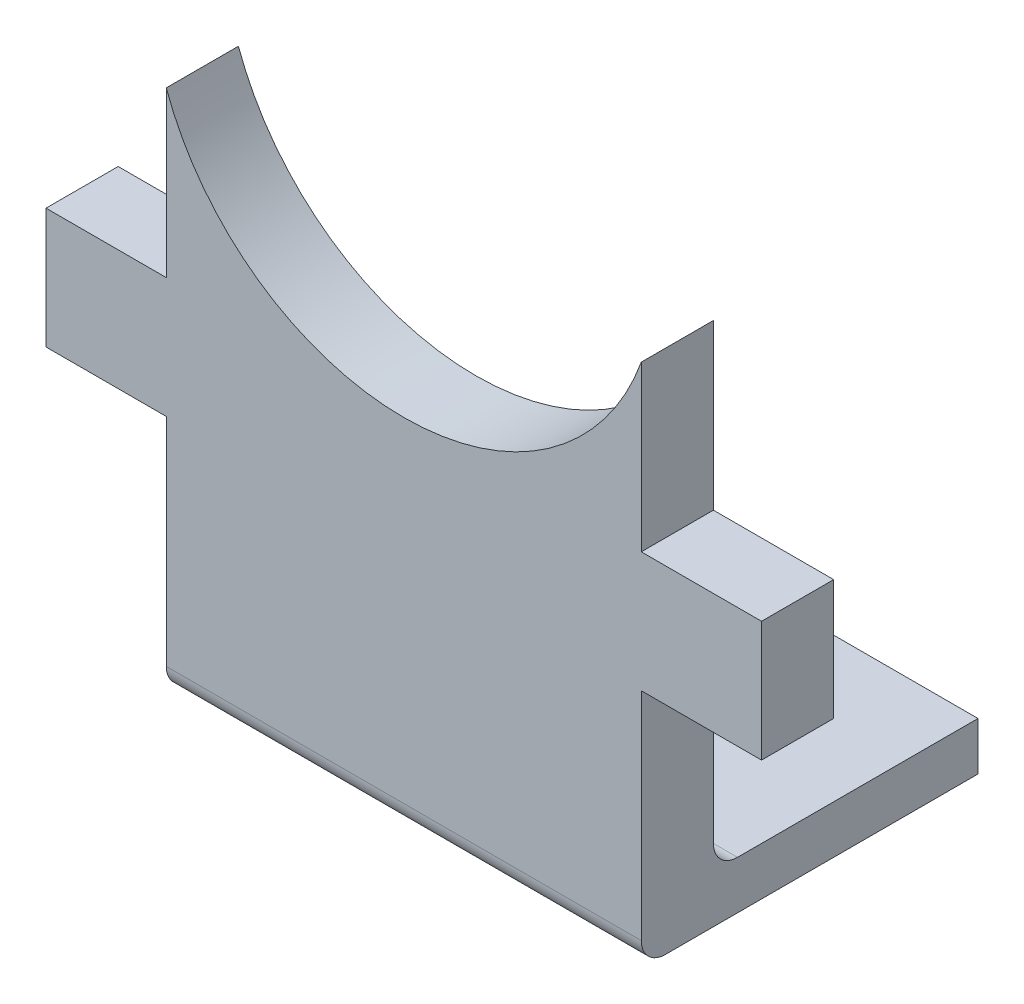
ISO-10303-21;
HEADER;
FILE_DESCRIPTION(('STEP AP214'),'2;1');
FILE_NAME('part.step','',(''),(''),'','','');
FILE_SCHEMA(('AUTOMOTIVE_DESIGN { 1 0 10303 214 1 1 1 1 }'));
ENDSEC;
DATA;
#1=APPLICATION_CONTEXT('core data for automotive mechanical design processes');
#2=APPLICATION_PROTOCOL_DEFINITION('international standard','automotive_design',2000,#1);
#3=PRODUCT_CONTEXT('',#1,'mechanical');
#4=PRODUCT('Part','Part','',(#3));
#5=PRODUCT_RELATED_PRODUCT_CATEGORY('part','',(#4));
#6=PRODUCT_DEFINITION_FORMATION('','',#4);
#7=PRODUCT_DEFINITION_CONTEXT('part definition',#1,'design');
#8=PRODUCT_DEFINITION('design','',#6,#7);
#9=PRODUCT_DEFINITION_SHAPE('','',#8);
#10=(LENGTH_UNIT() NAMED_UNIT(*) SI_UNIT(.MILLI.,.METRE.));
#11=(NAMED_UNIT(*) PLANE_ANGLE_UNIT() SI_UNIT($,.RADIAN.));
#12=(NAMED_UNIT(*) SI_UNIT($,.STERADIAN.) SOLID_ANGLE_UNIT());
#13=UNCERTAINTY_MEASURE_WITH_UNIT(LENGTH_MEASURE(1.E-05),#10,'distance_accuracy_value','');
#14=(GEOMETRIC_REPRESENTATION_CONTEXT(3) GLOBAL_UNCERTAINTY_ASSIGNED_CONTEXT((#13)) GLOBAL_UNIT_ASSIGNED_CONTEXT((#10,
#11,#12)) REPRESENTATION_CONTEXT('',''));
#15=CARTESIAN_POINT('',(0.,0.,0.));
#16=DIRECTION('',(0.,0.,1.));
#17=DIRECTION('',(1.,0.,0.));
#18=AXIS2_PLACEMENT_3D('',#15,#16,#17);
#19=CARTESIAN_POINT('',(0.,0.,0.));
#20=DIRECTION('',(0.,0.,1.));
#21=DIRECTION('',(1.,0.,0.));
#22=AXIS2_PLACEMENT_3D('',#19,#20,#21);
#23=PLANE('',#22);
#24=DIRECTION('',(0.,1.,0.));
#25=VECTOR('',#24,1.);
#26=CARTESIAN_POINT('',(9.875,0.,0.));
#27=LINE('',#26,#25);
#28=CARTESIAN_POINT('',(9.875,-22.4,0.));
#29=VERTEX_POINT('',#28);
#30=CARTESIAN_POINT('',(9.875,-15.4,0.));
#31=VERTEX_POINT('',#30);
#32=EDGE_CURVE('E254',#29,#31,#27,.T.);
#33=ORIENTED_EDGE('',*,*,#32,.F.);
#34=DIRECTION('',(1.,0.,0.));
#35=VECTOR('',#34,1.);
#36=CARTESIAN_POINT('',(-9.875,-22.4,0.));
#37=LINE('',#36,#35);
#38=CARTESIAN_POINT('',(-9.875,-22.4,0.));
#39=VERTEX_POINT('',#38);
#40=EDGE_CURVE('E68',#29,#39,#37,.F.);
#41=ORIENTED_EDGE('',*,*,#40,.T.);
#42=DIRECTION('',(0.,-1.,0.));
#43=VECTOR('',#42,1.);
#44=CARTESIAN_POINT('',(-9.875,0.,0.));
#45=LINE('',#44,#43);
#46=CARTESIAN_POINT('',(-9.875,-15.4,0.));
#47=VERTEX_POINT('',#46);
#48=EDGE_CURVE('E243',#47,#39,#45,.T.);
#49=ORIENTED_EDGE('',*,*,#48,.F.);
#50=DIRECTION('',(-1.,0.,0.));
#51=VECTOR('',#50,1.);
#52=CARTESIAN_POINT('',(0.,-15.4,0.));
#53=LINE('',#52,#51);
#54=CARTESIAN_POINT('',(-14.875,-15.4,0.));
#55=VERTEX_POINT('',#54);
#56=EDGE_CURVE('E250',#47,#55,#53,.T.);
#57=ORIENTED_EDGE('',*,*,#56,.T.);
#58=DIRECTION('',(0.,-1.,0.));
#59=VECTOR('',#58,1.);
#60=CARTESIAN_POINT('',(-14.875,0.,0.));
#61=LINE('',#60,#59);
#62=CARTESIAN_POINT('',(-14.875,-10.4,0.));
#63=VERTEX_POINT('',#62);
#64=EDGE_CURVE('E246',#63,#55,#61,.T.);
#65=ORIENTED_EDGE('',*,*,#64,.F.);
#66=DIRECTION('',(-1.,0.,0.));
#67=VECTOR('',#66,1.);
#68=CARTESIAN_POINT('',(0.,-10.4,0.));
#69=LINE('',#68,#67);
#70=CARTESIAN_POINT('',(-9.875,-10.4,0.));
#71=VERTEX_POINT('',#70);
#72=EDGE_CURVE('E242',#71,#63,#69,.T.);
#73=ORIENTED_EDGE('',*,*,#72,.F.);
#74=CARTESIAN_POINT('',(-9.875,-3.56852560590505,0.));
#75=VERTEX_POINT('',#74);
#76=EDGE_CURVE('E209',#75,#71,#45,.T.);
#77=ORIENTED_EDGE('',*,*,#76,.F.);
#78=CARTESIAN_POINT('',(0.,0.,0.));
#79=DIRECTION('',(0.,0.,1.));
#80=DIRECTION('',(1.,0.,0.));
#81=AXIS2_PLACEMENT_3D('',#78,#79,#80);
#82=CIRCLE('',#81,10.5);
#83=CARTESIAN_POINT('',(9.875,-3.56852560590505,0.));
#84=VERTEX_POINT('',#83);
#85=EDGE_CURVE('E309',#75,#84,#82,.T.);
#86=ORIENTED_EDGE('',*,*,#85,.T.);
#87=CARTESIAN_POINT('',(9.875,-10.4,0.));
#88=VERTEX_POINT('',#87);
#89=EDGE_CURVE('E214',#88,#84,#27,.T.);
#90=ORIENTED_EDGE('',*,*,#89,.F.);
#91=DIRECTION('',(1.,0.,0.));
#92=VECTOR('',#91,1.);
#93=CARTESIAN_POINT('',(0.,-10.4,0.));
#94=LINE('',#93,#92);
#95=CARTESIAN_POINT('',(14.875,-10.4,0.));
#96=VERTEX_POINT('',#95);
#97=EDGE_CURVE('E265',#88,#96,#94,.T.);
#98=ORIENTED_EDGE('',*,*,#97,.T.);
#99=DIRECTION('',(0.,-1.,0.));
#100=VECTOR('',#99,1.);
#101=CARTESIAN_POINT('',(14.875,0.,0.));
#102=LINE('',#101,#100);
#103=CARTESIAN_POINT('',(14.875,-15.4,0.));
#104=VERTEX_POINT('',#103);
#105=EDGE_CURVE('E261',#96,#104,#102,.T.);
#106=ORIENTED_EDGE('',*,*,#105,.T.);
#107=DIRECTION('',(1.,0.,0.));
#108=VECTOR('',#107,1.);
#109=CARTESIAN_POINT('',(0.,-15.4,0.));
#110=LINE('',#109,#108);
#111=EDGE_CURVE('E257',#31,#104,#110,.T.);
#112=ORIENTED_EDGE('',*,*,#111,.F.);
#113=EDGE_LOOP('',(#33,#41,#49,#57,#65,#73,#77,#86,#90,#98,#106,#112));
#114=FACE_BOUND('',#113,.T.);
#115=ADVANCED_FACE('F46',(#114),#23,.F.);
#116=CARTESIAN_POINT('',(-9.875,0.,3.));
#117=DIRECTION('',(1.,0.,0.));
#118=DIRECTION('',(0.,0.,-1.));
#119=AXIS2_PLACEMENT_3D('',#116,#117,#118);
#120=PLANE('',#119);
#121=DIRECTION('',(0.,-1.,0.));
#122=VECTOR('',#121,1.);
#123=CARTESIAN_POINT('',(-9.875,0.,3.));
#124=LINE('',#123,#122);
#125=CARTESIAN_POINT('',(-9.875,-3.56852560590505,3.));
#126=VERTEX_POINT('',#125);
#127=CARTESIAN_POINT('',(-9.875,-10.4,3.));
#128=VERTEX_POINT('',#127);
#129=EDGE_CURVE('E210',#126,#128,#124,.T.);
#130=ORIENTED_EDGE('',*,*,#129,.F.);
#131=DIRECTION('',(0.,0.,1.));
#132=VECTOR('',#131,1.);
#133=CARTESIAN_POINT('',(-9.875,-3.56852560590505,-7.));
#134=LINE('',#133,#132);
#135=EDGE_CURVE('E205',#126,#75,#134,.F.);
#136=ORIENTED_EDGE('',*,*,#135,.T.);
#137=ORIENTED_EDGE('',*,*,#76,.T.);
#138=DIRECTION('',(0.,0.,-1.));
#139=VECTOR('',#138,1.);
#140=CARTESIAN_POINT('',(-9.875,-10.4,3.));
#141=LINE('',#140,#139);
#142=EDGE_CURVE('E293',#128,#71,#141,.T.);
#143=ORIENTED_EDGE('',*,*,#142,.F.);
#144=EDGE_LOOP('',(#130,#136,#137,#143));
#145=FACE_BOUND('',#144,.T.);
#146=ADVANCED_FACE('F365',(#145),#120,.F.);
#147=CARTESIAN_POINT('',(0.,-10.4,3.));
#148=DIRECTION('',(0.,-1.,0.));
#149=DIRECTION('',(1.,0.,0.));
#150=AXIS2_PLACEMENT_3D('',#147,#148,#149);
#151=PLANE('',#150);
#152=ORIENTED_EDGE('',*,*,#72,.T.);
#153=DIRECTION('',(0.,0.,-1.));
#154=VECTOR('',#153,1.);
#155=CARTESIAN_POINT('',(-14.875,-10.4,3.));
#156=LINE('',#155,#154);
#157=CARTESIAN_POINT('',(-14.875,-10.4,3.));
#158=VERTEX_POINT('',#157);
#159=EDGE_CURVE('E289',#158,#63,#156,.T.);
#160=ORIENTED_EDGE('',*,*,#159,.F.);
#161=DIRECTION('',(-1.,0.,0.));
#162=VECTOR('',#161,1.);
#163=CARTESIAN_POINT('',(0.,-10.4,3.));
#164=LINE('',#163,#162);
#165=EDGE_CURVE('E213',#128,#158,#164,.T.);
#166=ORIENTED_EDGE('',*,*,#165,.F.);
#167=ORIENTED_EDGE('',*,*,#142,.T.);
#168=EDGE_LOOP('',(#152,#160,#166,#167));
#169=FACE_BOUND('',#168,.T.);
#170=ADVANCED_FACE('F371',(#169),#151,.F.);
#171=CARTESIAN_POINT('',(-14.875,0.,3.));
#172=DIRECTION('',(1.,0.,0.));
#173=DIRECTION('',(0.,1.,0.));
#174=AXIS2_PLACEMENT_3D('',#171,#172,#173);
#175=PLANE('',#174);
#176=ORIENTED_EDGE('',*,*,#64,.T.);
#177=DIRECTION('',(0.,0.,-1.));
#178=VECTOR('',#177,1.);
#179=CARTESIAN_POINT('',(-14.875,-15.4,3.));
#180=LINE('',#179,#178);
#181=CARTESIAN_POINT('',(-14.875,-15.4,3.));
#182=VERTEX_POINT('',#181);
#183=EDGE_CURVE('E286',#182,#55,#180,.T.);
#184=ORIENTED_EDGE('',*,*,#183,.F.);
#185=DIRECTION('',(0.,-1.,0.));
#186=VECTOR('',#185,1.);
#187=CARTESIAN_POINT('',(-14.875,0.,3.));
#188=LINE('',#187,#186);
#189=EDGE_CURVE('E218',#158,#182,#188,.T.);
#190=ORIENTED_EDGE('',*,*,#189,.F.);
#191=ORIENTED_EDGE('',*,*,#159,.T.);
#192=EDGE_LOOP('',(#176,#184,#190,#191));
#193=FACE_BOUND('',#192,.T.);
#194=ADVANCED_FACE('F375',(#193),#175,.F.);
#195=CARTESIAN_POINT('',(0.,-15.4,3.));
#196=DIRECTION('',(0.,-1.,0.));
#197=DIRECTION('',(1.,0.,0.));
#198=AXIS2_PLACEMENT_3D('',#195,#196,#197);
#199=PLANE('',#198);
#200=ORIENTED_EDGE('',*,*,#56,.F.);
#201=DIRECTION('',(0.,0.,-1.));
#202=VECTOR('',#201,1.);
#203=CARTESIAN_POINT('',(-9.875,-15.4,3.));
#204=LINE('',#203,#202);
#205=CARTESIAN_POINT('',(-9.875,-15.4,3.));
#206=VERTEX_POINT('',#205);
#207=EDGE_CURVE('E283',#206,#47,#204,.T.);
#208=ORIENTED_EDGE('',*,*,#207,.F.);
#209=DIRECTION('',(-1.,0.,0.));
#210=VECTOR('',#209,1.);
#211=CARTESIAN_POINT('',(0.,-15.4,3.));
#212=LINE('',#211,#210);
#213=EDGE_CURVE('E221',#206,#182,#212,.T.);
#214=ORIENTED_EDGE('',*,*,#213,.T.);
#215=ORIENTED_EDGE('',*,*,#183,.T.);
#216=EDGE_LOOP('',(#200,#208,#214,#215));
#217=FACE_BOUND('',#216,.T.);
#218=ADVANCED_FACE('F378',(#217),#199,.T.);
#219=DIRECTION('',(0.,0.,-1.));
#220=VECTOR('',#219,1.);
#221=CARTESIAN_POINT('',(-9.875,-25.4,3.));
#222=LINE('',#221,#220);
#223=CARTESIAN_POINT('',(-9.875,-25.4,2.));
#224=VERTEX_POINT('',#223);
#225=CARTESIAN_POINT('',(-9.875,-25.4,-11.));
#226=VERTEX_POINT('',#225);
#227=EDGE_CURVE('E168',#224,#226,#222,.T.);
#228=ORIENTED_EDGE('',*,*,#227,.F.);
#229=CARTESIAN_POINT('',(-9.875,-24.4,2.));
#230=DIRECTION('',(1.,0.,0.));
#231=DIRECTION('',(0.,0.,-1.));
#232=AXIS2_PLACEMENT_3D('',#229,#230,#231);
#233=CIRCLE('',#232,1.);
#234=CARTESIAN_POINT('',(-9.875,-24.4,3.));
#235=VERTEX_POINT('',#234);
#236=EDGE_CURVE('E306',#224,#235,#233,.F.);
#237=ORIENTED_EDGE('',*,*,#236,.T.);
#238=EDGE_CURVE('E215',#206,#235,#124,.T.);
#239=ORIENTED_EDGE('',*,*,#238,.F.);
#240=ORIENTED_EDGE('',*,*,#207,.T.);
#241=ORIENTED_EDGE('',*,*,#48,.T.);
#242=CARTESIAN_POINT('',(-9.875,-22.4,-1.));
#243=DIRECTION('',(1.,0.,0.));
#244=DIRECTION('',(0.,0.,-1.));
#245=AXIS2_PLACEMENT_3D('',#242,#243,#244);
#246=CIRCLE('',#245,1.);
#247=CARTESIAN_POINT('',(-9.875,-23.4,-1.));
#248=VERTEX_POINT('',#247);
#249=EDGE_CURVE('E11',#39,#248,#246,.T.);
#250=ORIENTED_EDGE('',*,*,#249,.T.);
#251=DIRECTION('',(0.,0.,1.));
#252=VECTOR('',#251,1.);
#253=CARTESIAN_POINT('',(-9.875,-23.4,-11.));
#254=LINE('',#253,#252);
#255=CARTESIAN_POINT('',(-9.875,-23.4,-11.));
#256=VERTEX_POINT('',#255);
#257=EDGE_CURVE('E194',#256,#248,#254,.T.);
#258=ORIENTED_EDGE('',*,*,#257,.F.);
#259=DIRECTION('',(0.,1.,0.));
#260=VECTOR('',#259,1.);
#261=CARTESIAN_POINT('',(-9.875,-25.4,-11.));
#262=LINE('',#261,#260);
#263=EDGE_CURVE('E178',#226,#256,#262,.T.);
#264=ORIENTED_EDGE('',*,*,#263,.F.);
#265=EDGE_LOOP('',(#228,#237,#239,#240,#241,#250,#258,#264));
#266=FACE_BOUND('',#265,.T.);
#267=ADVANCED_FACE('F328',(#266),#120,.F.);
#268=CARTESIAN_POINT('',(0.,-25.4,3.));
#269=DIRECTION('',(0.,1.,0.));
#270=DIRECTION('',(0.,0.,1.));
#271=AXIS2_PLACEMENT_3D('',#268,#269,#270);
#272=PLANE('',#271);
#273=DIRECTION('',(0.,0.,-1.));
#274=VECTOR('',#273,1.);
#275=CARTESIAN_POINT('',(9.875,-25.4,3.));
#276=LINE('',#275,#274);
#277=CARTESIAN_POINT('',(9.875,-25.4,2.));
#278=VERTEX_POINT('',#277);
#279=CARTESIAN_POINT('',(9.875,-25.4,-11.));
#280=VERTEX_POINT('',#279);
#281=EDGE_CURVE('E158',#278,#280,#276,.T.);
#282=ORIENTED_EDGE('',*,*,#281,.F.);
#283=DIRECTION('',(1.,0.,0.));
#284=VECTOR('',#283,1.);
#285=CARTESIAN_POINT('',(-9.875,-25.4,2.));
#286=LINE('',#285,#284);
#287=EDGE_CURVE('E303',#278,#224,#286,.F.);
#288=ORIENTED_EDGE('',*,*,#287,.T.);
#289=ORIENTED_EDGE('',*,*,#227,.T.);
#290=DIRECTION('',(-1.,0.,0.));
#291=VECTOR('',#290,1.);
#292=CARTESIAN_POINT('',(9.875,-25.4,-11.));
#293=LINE('',#292,#291);
#294=EDGE_CURVE('E172',#280,#226,#293,.T.);
#295=ORIENTED_EDGE('',*,*,#294,.F.);
#296=EDGE_LOOP('',(#282,#288,#289,#295));
#297=FACE_BOUND('',#296,.T.);
#298=ADVANCED_FACE('F173',(#297),#272,.F.);
#299=CARTESIAN_POINT('',(9.875,0.,3.));
#300=DIRECTION('',(-1.,0.,0.));
#301=DIRECTION('',(0.,0.,1.));
#302=AXIS2_PLACEMENT_3D('',#299,#300,#301);
#303=PLANE('',#302);
#304=DIRECTION('',(0.,1.,0.));
#305=VECTOR('',#304,1.);
#306=CARTESIAN_POINT('',(9.875,0.,3.));
#307=LINE('',#306,#305);
#308=CARTESIAN_POINT('',(9.875,-24.4,3.));
#309=VERTEX_POINT('',#308);
#310=CARTESIAN_POINT('',(9.875,-15.4,3.));
#311=VERTEX_POINT('',#310);
#312=EDGE_CURVE('E225',#309,#311,#307,.T.);
#313=ORIENTED_EDGE('',*,*,#312,.F.);
#314=CARTESIAN_POINT('',(9.875,-24.4,2.));
#315=DIRECTION('',(-1.,0.,0.));
#316=DIRECTION('',(0.,0.,1.));
#317=AXIS2_PLACEMENT_3D('',#314,#315,#316);
#318=CIRCLE('',#317,1.);
#319=EDGE_CURVE('E164',#309,#278,#318,.F.);
#320=ORIENTED_EDGE('',*,*,#319,.T.);
#321=ORIENTED_EDGE('',*,*,#281,.T.);
#322=DIRECTION('',(0.,-1.,0.));
#323=VECTOR('',#322,1.);
#324=CARTESIAN_POINT('',(9.875,-25.4,-11.));
#325=LINE('',#324,#323);
#326=CARTESIAN_POINT('',(9.875,-23.4,-11.));
#327=VERTEX_POINT('',#326);
#328=EDGE_CURVE('E163',#327,#280,#325,.T.);
#329=ORIENTED_EDGE('',*,*,#328,.F.);
#330=DIRECTION('',(0.,0.,1.));
#331=VECTOR('',#330,1.);
#332=CARTESIAN_POINT('',(9.875,-23.4,-11.));
#333=LINE('',#332,#331);
#334=CARTESIAN_POINT('',(9.875,-23.4,-1.));
#335=VERTEX_POINT('',#334);
#336=EDGE_CURVE('E191',#327,#335,#333,.T.);
#337=ORIENTED_EDGE('',*,*,#336,.T.);
#338=CARTESIAN_POINT('',(9.875,-22.4,-1.));
#339=DIRECTION('',(-1.,0.,0.));
#340=DIRECTION('',(0.,0.,1.));
#341=AXIS2_PLACEMENT_3D('',#338,#339,#340);
#342=CIRCLE('',#341,1.);
#343=EDGE_CURVE('E55',#335,#29,#342,.T.);
#344=ORIENTED_EDGE('',*,*,#343,.T.);
#345=ORIENTED_EDGE('',*,*,#32,.T.);
#346=DIRECTION('',(0.,0.,-1.));
#347=VECTOR('',#346,1.);
#348=CARTESIAN_POINT('',(9.875,-15.4,3.));
#349=LINE('',#348,#347);
#350=EDGE_CURVE('E169',#311,#31,#349,.T.);
#351=ORIENTED_EDGE('',*,*,#350,.F.);
#352=EDGE_LOOP('',(#313,#320,#321,#329,#337,#344,#345,#351));
#353=FACE_BOUND('',#352,.T.);
#354=ADVANCED_FACE('F161',(#353),#303,.F.);
#355=CARTESIAN_POINT('',(0.,-15.4,3.));
#356=DIRECTION('',(0.,1.,0.));
#357=DIRECTION('',(0.,0.,1.));
#358=AXIS2_PLACEMENT_3D('',#355,#356,#357);
#359=PLANE('',#358);
#360=ORIENTED_EDGE('',*,*,#111,.T.);
#361=DIRECTION('',(0.,0.,-1.));
#362=VECTOR('',#361,1.);
#363=CARTESIAN_POINT('',(14.875,-15.4,3.));
#364=LINE('',#363,#362);
#365=CARTESIAN_POINT('',(14.875,-15.4,3.));
#366=VERTEX_POINT('',#365);
#367=EDGE_CURVE('E275',#366,#104,#364,.T.);
#368=ORIENTED_EDGE('',*,*,#367,.F.);
#369=DIRECTION('',(1.,0.,0.));
#370=VECTOR('',#369,1.);
#371=CARTESIAN_POINT('',(0.,-15.4,3.));
#372=LINE('',#371,#370);
#373=EDGE_CURVE('E228',#311,#366,#372,.T.);
#374=ORIENTED_EDGE('',*,*,#373,.F.);
#375=ORIENTED_EDGE('',*,*,#350,.T.);
#376=EDGE_LOOP('',(#360,#368,#374,#375));
#377=FACE_BOUND('',#376,.T.);
#378=ADVANCED_FACE('F349',(#377),#359,.F.);
#379=CARTESIAN_POINT('',(14.875,0.,3.));
#380=DIRECTION('',(1.,0.,0.));
#381=DIRECTION('',(0.,0.,-1.));
#382=AXIS2_PLACEMENT_3D('',#379,#380,#381);
#383=PLANE('',#382);
#384=ORIENTED_EDGE('',*,*,#105,.F.);
#385=DIRECTION('',(0.,0.,-1.));
#386=VECTOR('',#385,1.);
#387=CARTESIAN_POINT('',(14.875,-10.4,3.));
#388=LINE('',#387,#386);
#389=CARTESIAN_POINT('',(14.875,-10.4,3.));
#390=VERTEX_POINT('',#389);
#391=EDGE_CURVE('E272',#390,#96,#388,.T.);
#392=ORIENTED_EDGE('',*,*,#391,.F.);
#393=DIRECTION('',(0.,-1.,0.));
#394=VECTOR('',#393,1.);
#395=CARTESIAN_POINT('',(14.875,0.,3.));
#396=LINE('',#395,#394);
#397=EDGE_CURVE('E232',#390,#366,#396,.T.);
#398=ORIENTED_EDGE('',*,*,#397,.T.);
#399=ORIENTED_EDGE('',*,*,#367,.T.);
#400=EDGE_LOOP('',(#384,#392,#398,#399));
#401=FACE_BOUND('',#400,.T.);
#402=ADVANCED_FACE('F399',(#401),#383,.T.);
#403=CARTESIAN_POINT('',(0.,-10.4,3.));
#404=DIRECTION('',(0.,1.,0.));
#405=DIRECTION('',(0.,0.,1.));
#406=AXIS2_PLACEMENT_3D('',#403,#404,#405);
#407=PLANE('',#406);
#408=ORIENTED_EDGE('',*,*,#97,.F.);
#409=DIRECTION('',(0.,0.,-1.));
#410=VECTOR('',#409,1.);
#411=CARTESIAN_POINT('',(9.875,-10.4,3.));
#412=LINE('',#411,#410);
#413=CARTESIAN_POINT('',(9.875,-10.4,3.));
#414=VERTEX_POINT('',#413);
#415=EDGE_CURVE('E269',#414,#88,#412,.T.);
#416=ORIENTED_EDGE('',*,*,#415,.F.);
#417=DIRECTION('',(1.,0.,0.));
#418=VECTOR('',#417,1.);
#419=CARTESIAN_POINT('',(0.,-10.4,3.));
#420=LINE('',#419,#418);
#421=EDGE_CURVE('E236',#414,#390,#420,.T.);
#422=ORIENTED_EDGE('',*,*,#421,.T.);
#423=ORIENTED_EDGE('',*,*,#391,.T.);
#424=EDGE_LOOP('',(#408,#416,#422,#423));
#425=FACE_BOUND('',#424,.T.);
#426=ADVANCED_FACE('F355',(#425),#407,.T.);
#427=ORIENTED_EDGE('',*,*,#89,.T.);
#428=DIRECTION('',(0.,0.,1.));
#429=VECTOR('',#428,1.);
#430=CARTESIAN_POINT('',(9.875,-3.56852560590505,-7.));
#431=LINE('',#430,#429);
#432=CARTESIAN_POINT('',(9.875,-3.56852560590505,3.));
#433=VERTEX_POINT('',#432);
#434=EDGE_CURVE('E201',#84,#433,#431,.T.);
#435=ORIENTED_EDGE('',*,*,#434,.T.);
#436=EDGE_CURVE('E229',#414,#433,#307,.T.);
#437=ORIENTED_EDGE('',*,*,#436,.F.);
#438=ORIENTED_EDGE('',*,*,#415,.T.);
#439=EDGE_LOOP('',(#427,#435,#437,#438));
#440=FACE_BOUND('',#439,.T.);
#441=ADVANCED_FACE('F360',(#440),#303,.F.);
#442=CARTESIAN_POINT('',(0.,0.,3.));
#443=DIRECTION('',(0.,0.,1.));
#444=DIRECTION('',(1.,0.,0.));
#445=AXIS2_PLACEMENT_3D('',#442,#443,#444);
#446=PLANE('',#445);
#447=CARTESIAN_POINT('',(0.,0.,3.));
#448=DIRECTION('',(0.,0.,1.));
#449=DIRECTION('',(1.,0.,0.));
#450=AXIS2_PLACEMENT_3D('',#447,#448,#449);
#451=CIRCLE('',#450,10.5);
#452=EDGE_CURVE('E198',#126,#433,#451,.T.);
#453=ORIENTED_EDGE('',*,*,#452,.F.);
#454=ORIENTED_EDGE('',*,*,#129,.T.);
#455=ORIENTED_EDGE('',*,*,#165,.T.);
#456=ORIENTED_EDGE('',*,*,#189,.T.);
#457=ORIENTED_EDGE('',*,*,#213,.F.);
#458=ORIENTED_EDGE('',*,*,#238,.T.);
#459=DIRECTION('',(1.,0.,0.));
#460=VECTOR('',#459,1.);
#461=CARTESIAN_POINT('',(9.875,-24.4,3.));
#462=LINE('',#461,#460);
#463=EDGE_CURVE('E297',#235,#309,#462,.T.);
#464=ORIENTED_EDGE('',*,*,#463,.T.);
#465=ORIENTED_EDGE('',*,*,#312,.T.);
#466=ORIENTED_EDGE('',*,*,#373,.T.);
#467=ORIENTED_EDGE('',*,*,#397,.F.);
#468=ORIENTED_EDGE('',*,*,#421,.F.);
#469=ORIENTED_EDGE('',*,*,#436,.T.);
#470=EDGE_LOOP('',(#453,#454,#455,#456,#457,#458,#464,#465,#466,#467,#468,#469));
#471=FACE_BOUND('',#470,.T.);
#472=ADVANCED_FACE('F342',(#471),#446,.T.);
#473=CARTESIAN_POINT('',(0.,-24.4,2.));
#474=DIRECTION('',(-1.,0.,0.));
#475=DIRECTION('',(0.,0.,1.));
#476=AXIS2_PLACEMENT_3D('',#473,#474,#475);
#477=CYLINDRICAL_SURFACE('',#476,1.);
#478=ORIENTED_EDGE('',*,*,#236,.F.);
#479=ORIENTED_EDGE('',*,*,#287,.F.);
#480=ORIENTED_EDGE('',*,*,#319,.F.);
#481=ORIENTED_EDGE('',*,*,#463,.F.);
#482=EDGE_LOOP('',(#478,#479,#480,#481));
#483=FACE_BOUND('',#482,.T.);
#484=ADVANCED_FACE('F339',(#483),#477,.T.);
#485=CARTESIAN_POINT('',(0.,0.,-7.));
#486=DIRECTION('',(0.,0.,1.));
#487=DIRECTION('',(1.,0.,0.));
#488=AXIS2_PLACEMENT_3D('',#485,#486,#487);
#489=CYLINDRICAL_SURFACE('',#488,10.5);
#490=ORIENTED_EDGE('',*,*,#452,.T.);
#491=ORIENTED_EDGE('',*,*,#434,.F.);
#492=ORIENTED_EDGE('',*,*,#85,.F.);
#493=ORIENTED_EDGE('',*,*,#135,.F.);
#494=EDGE_LOOP('',(#490,#491,#492,#493));
#495=FACE_BOUND('',#494,.T.);
#496=ADVANCED_FACE('F379',(#495),#489,.F.);
#497=CARTESIAN_POINT('',(9.875,-23.4,-11.));
#498=DIRECTION('',(0.,-1.,0.));
#499=DIRECTION('',(0.,0.,-1.));
#500=AXIS2_PLACEMENT_3D('',#497,#498,#499);
#501=PLANE('',#500);
#502=ORIENTED_EDGE('',*,*,#257,.T.);
#503=DIRECTION('',(1.,0.,0.));
#504=VECTOR('',#503,1.);
#505=CARTESIAN_POINT('',(9.875,-23.4,-1.));
#506=LINE('',#505,#504);
#507=EDGE_CURVE('E313',#248,#335,#506,.T.);
#508=ORIENTED_EDGE('',*,*,#507,.T.);
#509=ORIENTED_EDGE('',*,*,#336,.F.);
#510=DIRECTION('',(1.,0.,0.));
#511=VECTOR('',#510,1.);
#512=CARTESIAN_POINT('',(9.875,-23.4,-11.));
#513=LINE('',#512,#511);
#514=EDGE_CURVE('E182',#256,#327,#513,.T.);
#515=ORIENTED_EDGE('',*,*,#514,.F.);
#516=EDGE_LOOP('',(#502,#508,#509,#515));
#517=FACE_BOUND('',#516,.T.);
#518=ADVANCED_FACE('F335',(#517),#501,.F.);
#519=CARTESIAN_POINT('',(0.,0.,-11.));
#520=DIRECTION('',(0.,0.,1.));
#521=DIRECTION('',(1.,0.,0.));
#522=AXIS2_PLACEMENT_3D('',#519,#520,#521);
#523=PLANE('',#522);
#524=ORIENTED_EDGE('',*,*,#328,.T.);
#525=ORIENTED_EDGE('',*,*,#294,.T.);
#526=ORIENTED_EDGE('',*,*,#263,.T.);
#527=ORIENTED_EDGE('',*,*,#514,.T.);
#528=EDGE_LOOP('',(#524,#525,#526,#527));
#529=FACE_BOUND('',#528,.T.);
#530=ADVANCED_FACE('F180',(#529),#523,.F.);
#531=CARTESIAN_POINT('',(9.875,-22.4,-1.));
#532=DIRECTION('',(-1.,0.,0.));
#533=DIRECTION('',(0.,0.,1.));
#534=AXIS2_PLACEMENT_3D('',#531,#532,#533);
#535=CYLINDRICAL_SURFACE('',#534,1.);
#536=ORIENTED_EDGE('',*,*,#249,.F.);
#537=ORIENTED_EDGE('',*,*,#40,.F.);
#538=ORIENTED_EDGE('',*,*,#343,.F.);
#539=ORIENTED_EDGE('',*,*,#507,.F.);
#540=EDGE_LOOP('',(#536,#537,#538,#539));
#541=FACE_BOUND('',#540,.T.);
#542=ADVANCED_FACE('F48',(#541),#535,.F.);
#543=CLOSED_SHELL('',(#115,#146,#170,#194,#218,#267,#298,#354,#378,#402,#426,#441,#472,#484,
#496,#518,#530,#542));
#544=MANIFOLD_SOLID_BREP('B2',#543);
#545=ADVANCED_BREP_SHAPE_REPRESENTATION('',(#18,#544),#14);
#546=SHAPE_DEFINITION_REPRESENTATION(#9,#545);
ENDSEC;
END-ISO-10303-21;
